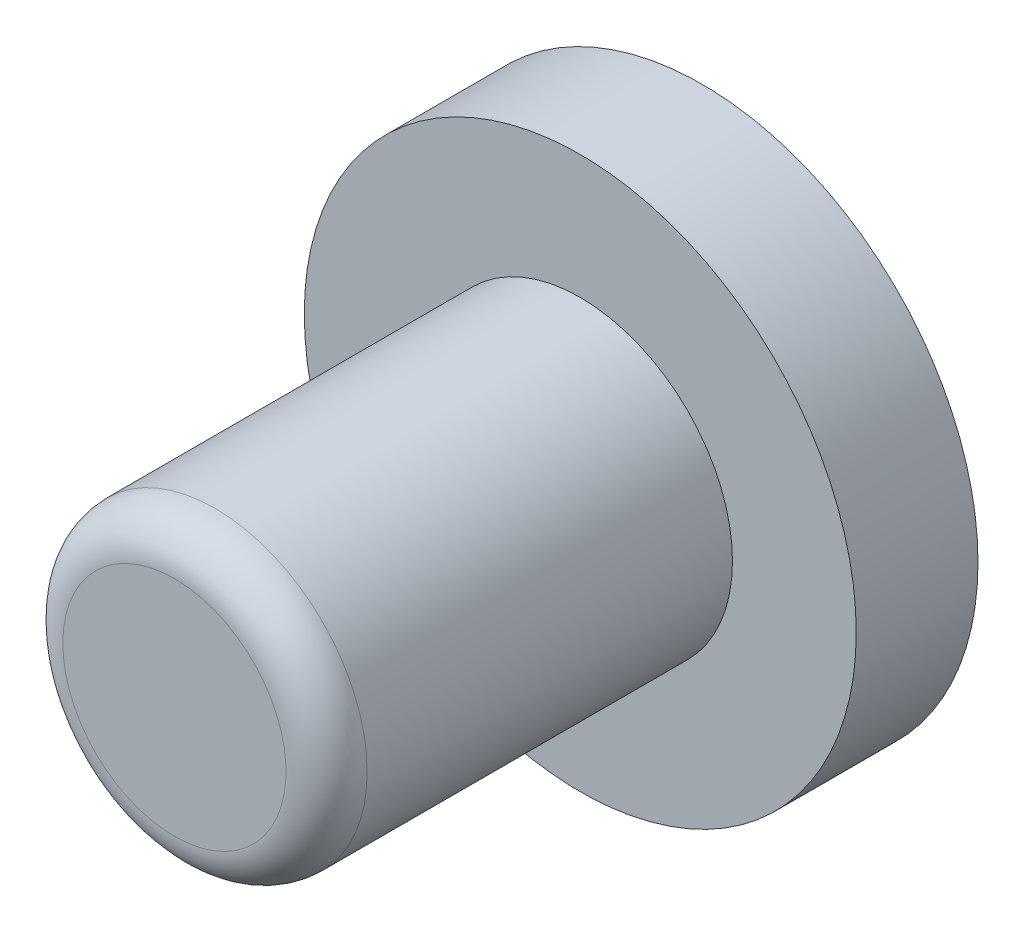
ISO-10303-21;
HEADER;
FILE_DESCRIPTION(('STEP AP214'),'2;1');
FILE_NAME('part.step','',(''),(''),'','','');
FILE_SCHEMA(('AUTOMOTIVE_DESIGN { 1 0 10303 214 1 1 1 1 }'));
ENDSEC;
DATA;
#1=APPLICATION_CONTEXT('core data for automotive mechanical design processes');
#2=APPLICATION_PROTOCOL_DEFINITION('international standard','automotive_design',2000,#1);
#3=PRODUCT_CONTEXT('',#1,'mechanical');
#4=PRODUCT('Part','Part','',(#3));
#5=PRODUCT_RELATED_PRODUCT_CATEGORY('part','',(#4));
#6=PRODUCT_DEFINITION_FORMATION('','',#4);
#7=PRODUCT_DEFINITION_CONTEXT('part definition',#1,'design');
#8=PRODUCT_DEFINITION('design','',#6,#7);
#9=PRODUCT_DEFINITION_SHAPE('','',#8);
#10=(LENGTH_UNIT() NAMED_UNIT(*) SI_UNIT(.MILLI.,.METRE.));
#11=(NAMED_UNIT(*) PLANE_ANGLE_UNIT() SI_UNIT($,.RADIAN.));
#12=(NAMED_UNIT(*) SI_UNIT($,.STERADIAN.) SOLID_ANGLE_UNIT());
#13=UNCERTAINTY_MEASURE_WITH_UNIT(LENGTH_MEASURE(1.E-05),#10,'distance_accuracy_value','');
#14=(GEOMETRIC_REPRESENTATION_CONTEXT(3) GLOBAL_UNCERTAINTY_ASSIGNED_CONTEXT((#13)) GLOBAL_UNIT_ASSIGNED_CONTEXT((#10,
#11,#12)) REPRESENTATION_CONTEXT('',''));
#15=CARTESIAN_POINT('',(0.,0.,0.));
#16=DIRECTION('',(0.,0.,1.));
#17=DIRECTION('',(1.,0.,0.));
#18=AXIS2_PLACEMENT_3D('',#15,#16,#17);
#19=CARTESIAN_POINT('',(3.33066907387547E-13,0.,-16.51));
#20=DIRECTION('',(0.,0.,1.));
#21=DIRECTION('',(1.,0.,0.));
#22=AXIS2_PLACEMENT_3D('',#19,#20,#21);
#23=PLANE('',#22);
#24=CARTESIAN_POINT('',(3.33066907387547E-13,0.,-16.51));
#25=DIRECTION('',(0.,0.,1.));
#26=DIRECTION('',(1.,0.,0.));
#27=AXIS2_PLACEMENT_3D('',#24,#25,#26);
#28=CIRCLE('',#27,17.272);
#29=CARTESIAN_POINT('',(17.2720000000003,0.,-16.51));
#30=VERTEX_POINT('',#29);
#31=EDGE_CURVE('E330',#30,#30,#28,.T.);
#32=ORIENTED_EDGE('',*,*,#31,.F.);
#33=EDGE_LOOP('',(#32));
#34=FACE_BOUND('',#33,.T.);
#35=ADVANCED_FACE('F311',(#34),#23,.F.);
#36=CARTESIAN_POINT('',(0.,2.22044604925031E-13,51.4864864864865));
#37=DIRECTION('',(0.,0.,1.));
#38=DIRECTION('',(1.,0.,0.));
#39=AXIS2_PLACEMENT_3D('',#36,#37,#38);
#40=CYLINDRICAL_SURFACE('',#39,17.272);
#41=CARTESIAN_POINT('',(0.,4.44089209850063E-13,-8.88999999999995));
#42=DIRECTION('',(0.,0.,1.));
#43=DIRECTION('',(1.,0.,0.));
#44=AXIS2_PLACEMENT_3D('',#41,#42,#43);
#45=CIRCLE('',#44,17.272);
#46=CARTESIAN_POINT('',(17.272,4.44089209850063E-13,-8.88999999999995));
#47=VERTEX_POINT('',#46);
#48=EDGE_CURVE('E334',#47,#47,#45,.T.);
#49=ORIENTED_EDGE('',*,*,#48,.F.);
#50=EDGE_LOOP('',(#49));
#51=FACE_BOUND('',#50,.T.);
#52=ORIENTED_EDGE('',*,*,#31,.T.);
#53=EDGE_LOOP('',(#52));
#54=FACE_BOUND('',#53,.T.);
#55=ADVANCED_FACE('F348',(#51,#54),#40,.T.);
#56=CARTESIAN_POINT('',(0.,17.2720000000004,-8.89000000000006));
#57=DIRECTION('',(0.,0.,-1.));
#58=DIRECTION('',(-1.,0.,0.));
#59=AXIS2_PLACEMENT_3D('',#56,#57,#58);
#60=PLANE('',#59);
#61=CARTESIAN_POINT('',(0.,4.44089209850063E-13,-8.88999999999995));
#62=DIRECTION('',(0.,0.,1.));
#63=DIRECTION('',(1.,0.,0.));
#64=AXIS2_PLACEMENT_3D('',#61,#62,#63);
#65=CIRCLE('',#64,9.525);
#66=CARTESIAN_POINT('',(9.52500000000001,4.44089209850063E-13,-8.88999999999995));
#67=VERTEX_POINT('',#66);
#68=EDGE_CURVE('E336',#67,#67,#65,.T.);
#69=ORIENTED_EDGE('',*,*,#68,.F.);
#70=EDGE_LOOP('',(#69));
#71=FACE_BOUND('',#70,.T.);
#72=ORIENTED_EDGE('',*,*,#48,.T.);
#73=EDGE_LOOP('',(#72));
#74=FACE_BOUND('',#73,.T.);
#75=ADVANCED_FACE('F350',(#71,#74),#60,.F.);
#76=CARTESIAN_POINT('',(0.,2.22044604925031E-13,51.4864864864865));
#77=DIRECTION('',(0.,0.,1.));
#78=DIRECTION('',(1.,0.,0.));
#79=AXIS2_PLACEMENT_3D('',#76,#77,#78);
#80=CYLINDRICAL_SURFACE('',#79,9.525);
#81=CARTESIAN_POINT('',(0.,0.,13.97));
#82=DIRECTION('',(0.,0.,-1.));
#83=DIRECTION('',(-1.,0.,0.));
#84=AXIS2_PLACEMENT_3D('',#81,#82,#83);
#85=CIRCLE('',#84,9.525);
#86=CARTESIAN_POINT('',(-9.52500000000001,0.,13.97));
#87=VERTEX_POINT('',#86);
#88=EDGE_CURVE('E11',#87,#87,#85,.T.);
#89=ORIENTED_EDGE('',*,*,#88,.T.);
#90=EDGE_LOOP('',(#89));
#91=FACE_BOUND('',#90,.T.);
#92=ORIENTED_EDGE('',*,*,#68,.T.);
#93=EDGE_LOOP('',(#92));
#94=FACE_BOUND('',#93,.T.);
#95=ADVANCED_FACE('F343',(#91,#94),#80,.T.);
#96=CARTESIAN_POINT('',(2.22044604925031E-13,9.52500000000045,16.51));
#97=DIRECTION('',(0.,0.,-1.));
#98=DIRECTION('',(-1.,0.,0.));
#99=AXIS2_PLACEMENT_3D('',#96,#97,#98);
#100=PLANE('',#99);
#101=CARTESIAN_POINT('',(0.,0.,16.51));
#102=DIRECTION('',(0.,0.,-1.));
#103=DIRECTION('',(-1.,0.,0.));
#104=AXIS2_PLACEMENT_3D('',#101,#102,#103);
#105=CIRCLE('',#104,6.985);
#106=CARTESIAN_POINT('',(-6.985,0.,16.51));
#107=VERTEX_POINT('',#106);
#108=EDGE_CURVE('E321',#107,#107,#105,.F.);
#109=ORIENTED_EDGE('',*,*,#108,.T.);
#110=EDGE_LOOP('',(#109));
#111=FACE_BOUND('',#110,.T.);
#112=ADVANCED_FACE('F368',(#111),#100,.F.);
#113=CARTESIAN_POINT('',(0.,0.,13.97));
#114=DIRECTION('',(0.,0.,-1.));
#115=DIRECTION('',(-1.,0.,0.));
#116=AXIS2_PLACEMENT_3D('',#113,#114,#115);
#117=TOROIDAL_SURFACE('',#116,6.985,2.54);
#118=ORIENTED_EDGE('',*,*,#88,.F.);
#119=EDGE_LOOP('',(#118));
#120=FACE_BOUND('',#119,.T.);
#121=ORIENTED_EDGE('',*,*,#108,.F.);
#122=EDGE_LOOP('',(#121));
#123=FACE_BOUND('',#122,.T.);
#124=ADVANCED_FACE('F312',(#120,#123),#117,.T.);
#125=CLOSED_SHELL('',(#35,#55,#75,#95,#112,#124));
#126=MANIFOLD_SOLID_BREP('B2',#125);
#127=ADVANCED_BREP_SHAPE_REPRESENTATION('',(#18,#126),#14);
#128=SHAPE_DEFINITION_REPRESENTATION(#9,#127);
ENDSEC;
END-ISO-10303-21;
